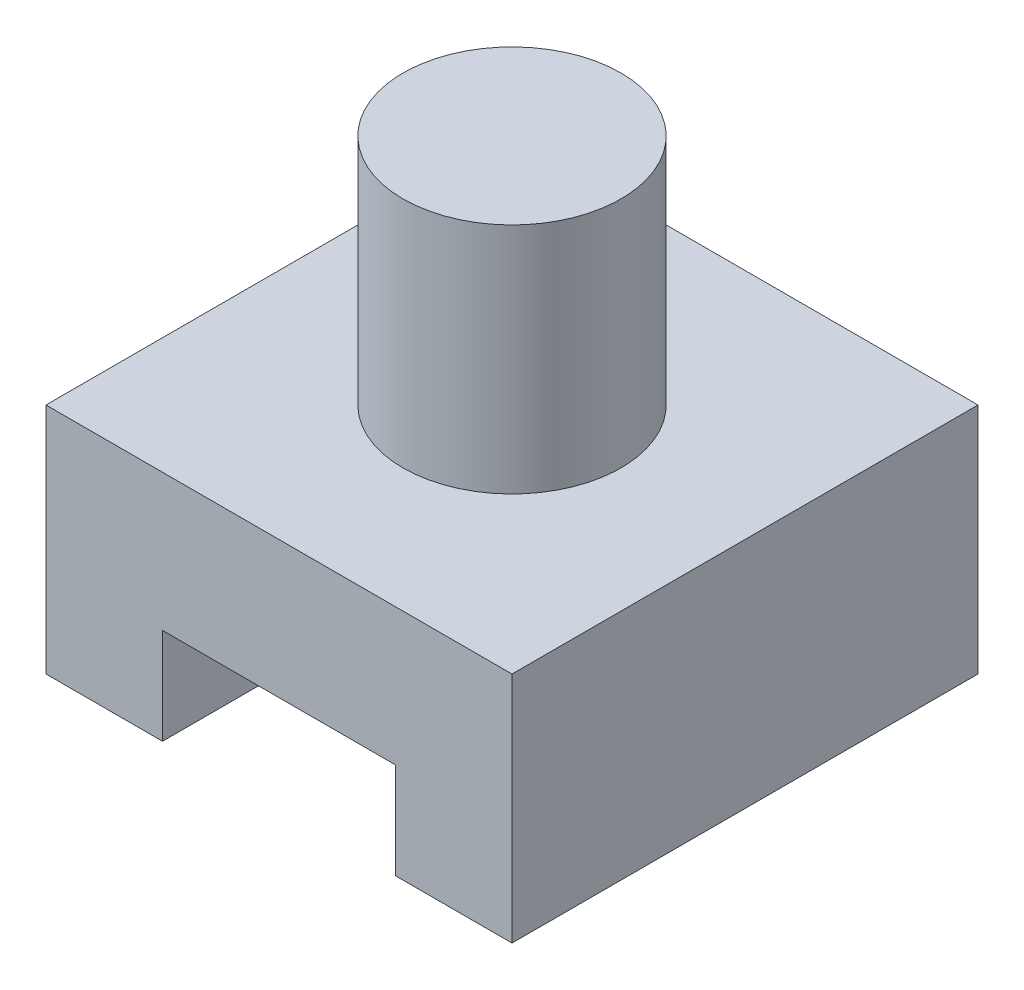
ISO-10303-21;
HEADER;
FILE_DESCRIPTION(('STEP AP214'),'2;1');
FILE_NAME('part.step','',(''),(''),'','','');
FILE_SCHEMA(('AUTOMOTIVE_DESIGN { 1 0 10303 214 1 1 1 1 }'));
ENDSEC;
DATA;
#1=APPLICATION_CONTEXT('core data for automotive mechanical design processes');
#2=APPLICATION_PROTOCOL_DEFINITION('international standard','automotive_design',2000,#1);
#3=PRODUCT_CONTEXT('',#1,'mechanical');
#4=PRODUCT('Part','Part','',(#3));
#5=PRODUCT_RELATED_PRODUCT_CATEGORY('part','',(#4));
#6=PRODUCT_DEFINITION_FORMATION('','',#4);
#7=PRODUCT_DEFINITION_CONTEXT('part definition',#1,'design');
#8=PRODUCT_DEFINITION('design','',#6,#7);
#9=PRODUCT_DEFINITION_SHAPE('','',#8);
#10=(LENGTH_UNIT() NAMED_UNIT(*) SI_UNIT(.MILLI.,.METRE.));
#11=(NAMED_UNIT(*) PLANE_ANGLE_UNIT() SI_UNIT($,.RADIAN.));
#12=(NAMED_UNIT(*) SI_UNIT($,.STERADIAN.) SOLID_ANGLE_UNIT());
#13=UNCERTAINTY_MEASURE_WITH_UNIT(LENGTH_MEASURE(1.E-05),#10,'distance_accuracy_value','');
#14=(GEOMETRIC_REPRESENTATION_CONTEXT(3) GLOBAL_UNCERTAINTY_ASSIGNED_CONTEXT((#13)) GLOBAL_UNIT_ASSIGNED_CONTEXT((#10,
#11,#12)) REPRESENTATION_CONTEXT('',''));
#15=CARTESIAN_POINT('',(0.,0.,0.));
#16=DIRECTION('',(0.,0.,1.));
#17=DIRECTION('',(1.,0.,0.));
#18=AXIS2_PLACEMENT_3D('',#15,#16,#17);
#19=CARTESIAN_POINT('',(0.,0.,0.));
#20=DIRECTION('',(0.,-1.,0.));
#21=DIRECTION('',(0.,0.,-1.));
#22=AXIS2_PLACEMENT_3D('',#19,#20,#21);
#23=PLANE('',#22);
#24=DIRECTION('',(0.,0.,-1.));
#25=VECTOR('',#24,1.);
#26=CARTESIAN_POINT('',(10.,0.,0.));
#27=LINE('',#26,#25);
#28=CARTESIAN_POINT('',(10.,0.,0.));
#29=VERTEX_POINT('',#28);
#30=CARTESIAN_POINT('',(10.,0.,-40.));
#31=VERTEX_POINT('',#30);
#32=EDGE_CURVE('E121',#29,#31,#27,.T.);
#33=ORIENTED_EDGE('',*,*,#32,.F.);
#34=DIRECTION('',(1.,0.,0.));
#35=VECTOR('',#34,1.);
#36=CARTESIAN_POINT('',(0.,0.,0.));
#37=LINE('',#36,#35);
#38=CARTESIAN_POINT('',(0.,0.,0.));
#39=VERTEX_POINT('',#38);
#40=EDGE_CURVE('E136',#39,#29,#37,.T.);
#41=ORIENTED_EDGE('',*,*,#40,.F.);
#42=DIRECTION('',(0.,0.,1.));
#43=VECTOR('',#42,1.);
#44=CARTESIAN_POINT('',(0.,0.,0.));
#45=LINE('',#44,#43);
#46=CARTESIAN_POINT('',(0.,0.,-40.));
#47=VERTEX_POINT('',#46);
#48=EDGE_CURVE('E137',#47,#39,#45,.T.);
#49=ORIENTED_EDGE('',*,*,#48,.F.);
#50=DIRECTION('',(-1.,0.,0.));
#51=VECTOR('',#50,1.);
#52=CARTESIAN_POINT('',(0.,0.,-40.));
#53=LINE('',#52,#51);
#54=EDGE_CURVE('E83',#31,#47,#53,.T.);
#55=ORIENTED_EDGE('',*,*,#54,.F.);
#56=EDGE_LOOP('',(#33,#41,#49,#55));
#57=FACE_BOUND('',#56,.T.);
#58=ADVANCED_FACE('F37',(#57),#23,.T.);
#59=CARTESIAN_POINT('',(0.,20.,0.));
#60=DIRECTION('',(1.,0.,0.));
#61=DIRECTION('',(0.,0.,-1.));
#62=AXIS2_PLACEMENT_3D('',#59,#60,#61);
#63=PLANE('',#62);
#64=ORIENTED_EDGE('',*,*,#48,.T.);
#65=DIRECTION('',(0.,-1.,0.));
#66=VECTOR('',#65,1.);
#67=CARTESIAN_POINT('',(0.,20.,0.));
#68=LINE('',#67,#66);
#69=CARTESIAN_POINT('',(0.,20.,0.));
#70=VERTEX_POINT('',#69);
#71=EDGE_CURVE('E122',#70,#39,#68,.T.);
#72=ORIENTED_EDGE('',*,*,#71,.F.);
#73=DIRECTION('',(0.,0.,1.));
#74=VECTOR('',#73,1.);
#75=CARTESIAN_POINT('',(0.,20.,0.));
#76=LINE('',#75,#74);
#77=CARTESIAN_POINT('',(0.,20.,-40.));
#78=VERTEX_POINT('',#77);
#79=EDGE_CURVE('E147',#78,#70,#76,.T.);
#80=ORIENTED_EDGE('',*,*,#79,.F.);
#81=DIRECTION('',(0.,-1.,0.));
#82=VECTOR('',#81,1.);
#83=CARTESIAN_POINT('',(0.,20.,-40.));
#84=LINE('',#83,#82);
#85=EDGE_CURVE('E148',#78,#47,#84,.T.);
#86=ORIENTED_EDGE('',*,*,#85,.T.);
#87=EDGE_LOOP('',(#64,#72,#80,#86));
#88=FACE_BOUND('',#87,.T.);
#89=ADVANCED_FACE('F39',(#88),#63,.F.);
#90=CARTESIAN_POINT('',(0.,20.,0.));
#91=DIRECTION('',(0.,0.,-1.));
#92=DIRECTION('',(-1.,0.,0.));
#93=AXIS2_PLACEMENT_3D('',#90,#91,#92);
#94=PLANE('',#93);
#95=ORIENTED_EDGE('',*,*,#40,.T.);
#96=DIRECTION('',(0.,-1.,0.));
#97=VECTOR('',#96,1.);
#98=CARTESIAN_POINT('',(10.,0.,0.));
#99=LINE('',#98,#97);
#100=CARTESIAN_POINT('',(10.,8.24257646722698,0.));
#101=VERTEX_POINT('',#100);
#102=EDGE_CURVE('E164',#101,#29,#99,.T.);
#103=ORIENTED_EDGE('',*,*,#102,.F.);
#104=DIRECTION('',(-1.,0.,0.));
#105=VECTOR('',#104,1.);
#106=CARTESIAN_POINT('',(10.,8.24257646722698,0.));
#107=LINE('',#106,#105);
#108=CARTESIAN_POINT('',(30.,8.24257646722698,0.));
#109=VERTEX_POINT('',#108);
#110=EDGE_CURVE('E130',#109,#101,#107,.T.);
#111=ORIENTED_EDGE('',*,*,#110,.F.);
#112=DIRECTION('',(0.,1.,0.));
#113=VECTOR('',#112,1.);
#114=CARTESIAN_POINT('',(30.,8.24257646722698,0.));
#115=LINE('',#114,#113);
#116=CARTESIAN_POINT('',(30.,0.,0.));
#117=VERTEX_POINT('',#116);
#118=EDGE_CURVE('E115',#117,#109,#115,.T.);
#119=ORIENTED_EDGE('',*,*,#118,.F.);
#120=CARTESIAN_POINT('',(40.,0.,0.));
#121=VERTEX_POINT('',#120);
#122=EDGE_CURVE('E126',#117,#121,#37,.T.);
#123=ORIENTED_EDGE('',*,*,#122,.T.);
#124=DIRECTION('',(0.,-1.,0.));
#125=VECTOR('',#124,1.);
#126=CARTESIAN_POINT('',(40.,20.,0.));
#127=LINE('',#126,#125);
#128=CARTESIAN_POINT('',(40.,20.,0.));
#129=VERTEX_POINT('',#128);
#130=EDGE_CURVE('E153',#129,#121,#127,.T.);
#131=ORIENTED_EDGE('',*,*,#130,.F.);
#132=DIRECTION('',(1.,0.,0.));
#133=VECTOR('',#132,1.);
#134=CARTESIAN_POINT('',(0.,20.,0.));
#135=LINE('',#134,#133);
#136=EDGE_CURVE('E91',#70,#129,#135,.T.);
#137=ORIENTED_EDGE('',*,*,#136,.F.);
#138=ORIENTED_EDGE('',*,*,#71,.T.);
#139=EDGE_LOOP('',(#95,#103,#111,#119,#123,#131,#137,#138));
#140=FACE_BOUND('',#139,.T.);
#141=ADVANCED_FACE('F125',(#140),#94,.F.);
#142=CARTESIAN_POINT('',(40.,20.,0.));
#143=DIRECTION('',(-1.,0.,0.));
#144=DIRECTION('',(0.,0.,1.));
#145=AXIS2_PLACEMENT_3D('',#142,#143,#144);
#146=PLANE('',#145);
#147=DIRECTION('',(0.,0.,-1.));
#148=VECTOR('',#147,1.);
#149=CARTESIAN_POINT('',(40.,0.,0.));
#150=LINE('',#149,#148);
#151=CARTESIAN_POINT('',(40.,0.,-40.));
#152=VERTEX_POINT('',#151);
#153=EDGE_CURVE('E135',#121,#152,#150,.T.);
#154=ORIENTED_EDGE('',*,*,#153,.T.);
#155=DIRECTION('',(0.,-1.,0.));
#156=VECTOR('',#155,1.);
#157=CARTESIAN_POINT('',(40.,20.,-40.));
#158=LINE('',#157,#156);
#159=CARTESIAN_POINT('',(40.,20.,-40.));
#160=VERTEX_POINT('',#159);
#161=EDGE_CURVE('E150',#160,#152,#158,.T.);
#162=ORIENTED_EDGE('',*,*,#161,.F.);
#163=DIRECTION('',(0.,0.,-1.));
#164=VECTOR('',#163,1.);
#165=CARTESIAN_POINT('',(40.,20.,0.));
#166=LINE('',#165,#164);
#167=EDGE_CURVE('E173',#129,#160,#166,.T.);
#168=ORIENTED_EDGE('',*,*,#167,.F.);
#169=ORIENTED_EDGE('',*,*,#130,.T.);
#170=EDGE_LOOP('',(#154,#162,#168,#169));
#171=FACE_BOUND('',#170,.T.);
#172=ADVANCED_FACE('F178',(#171),#146,.F.);
#173=CARTESIAN_POINT('',(0.,20.,-40.));
#174=DIRECTION('',(0.,0.,1.));
#175=DIRECTION('',(1.,0.,0.));
#176=AXIS2_PLACEMENT_3D('',#173,#174,#175);
#177=PLANE('',#176);
#178=DIRECTION('',(-1.,0.,0.));
#179=VECTOR('',#178,1.);
#180=CARTESIAN_POINT('',(0.,8.24257646722698,-40.));
#181=LINE('',#180,#179);
#182=CARTESIAN_POINT('',(30.,8.24257646722698,-40.));
#183=VERTEX_POINT('',#182);
#184=CARTESIAN_POINT('',(10.,8.24257646722698,-40.));
#185=VERTEX_POINT('',#184);
#186=EDGE_CURVE('E41',#183,#185,#181,.T.);
#187=ORIENTED_EDGE('',*,*,#186,.T.);
#188=DIRECTION('',(0.,-1.,0.));
#189=VECTOR('',#188,1.);
#190=CARTESIAN_POINT('',(10.,20.,-40.));
#191=LINE('',#190,#189);
#192=EDGE_CURVE('E140',#185,#31,#191,.T.);
#193=ORIENTED_EDGE('',*,*,#192,.T.);
#194=ORIENTED_EDGE('',*,*,#54,.T.);
#195=ORIENTED_EDGE('',*,*,#85,.F.);
#196=DIRECTION('',(-1.,0.,0.));
#197=VECTOR('',#196,1.);
#198=CARTESIAN_POINT('',(0.,20.,-40.));
#199=LINE('',#198,#197);
#200=EDGE_CURVE('E62',#160,#78,#199,.T.);
#201=ORIENTED_EDGE('',*,*,#200,.F.);
#202=ORIENTED_EDGE('',*,*,#161,.T.);
#203=CARTESIAN_POINT('',(30.,0.,-40.));
#204=VERTEX_POINT('',#203);
#205=EDGE_CURVE('E145',#152,#204,#53,.T.);
#206=ORIENTED_EDGE('',*,*,#205,.T.);
#207=DIRECTION('',(0.,1.,0.));
#208=VECTOR('',#207,1.);
#209=CARTESIAN_POINT('',(30.,20.,-40.));
#210=LINE('',#209,#208);
#211=EDGE_CURVE('E53',#204,#183,#210,.T.);
#212=ORIENTED_EDGE('',*,*,#211,.T.);
#213=EDGE_LOOP('',(#187,#193,#194,#195,#201,#202,#206,#212));
#214=FACE_BOUND('',#213,.T.);
#215=ADVANCED_FACE('F158',(#214),#177,.F.);
#216=CARTESIAN_POINT('',(0.,20.,0.));
#217=DIRECTION('',(0.,-1.,0.));
#218=DIRECTION('',(0.,0.,-1.));
#219=AXIS2_PLACEMENT_3D('',#216,#217,#218);
#220=PLANE('',#219);
#221=CARTESIAN_POINT('',(20.,20.,-20.));
#222=DIRECTION('',(0.,1.,0.));
#223=DIRECTION('',(0.,0.,1.));
#224=AXIS2_PLACEMENT_3D('',#221,#222,#223);
#225=CIRCLE('',#224,9.35967193698637);
#226=CARTESIAN_POINT('',(20.,20.,-10.6403280630136));
#227=VERTEX_POINT('',#226);
#228=EDGE_CURVE('E11',#227,#227,#225,.T.);
#229=ORIENTED_EDGE('',*,*,#228,.F.);
#230=EDGE_LOOP('',(#229));
#231=FACE_BOUND('',#230,.T.);
#232=ORIENTED_EDGE('',*,*,#79,.T.);
#233=ORIENTED_EDGE('',*,*,#136,.T.);
#234=ORIENTED_EDGE('',*,*,#167,.T.);
#235=ORIENTED_EDGE('',*,*,#200,.T.);
#236=EDGE_LOOP('',(#232,#233,#234,#235));
#237=FACE_BOUND('',#236,.T.);
#238=ADVANCED_FACE('F176',(#231,#237),#220,.F.);
#239=DIRECTION('',(0.,0.,1.));
#240=VECTOR('',#239,1.);
#241=CARTESIAN_POINT('',(30.,0.,0.));
#242=LINE('',#241,#240);
#243=EDGE_CURVE('E112',#204,#117,#242,.T.);
#244=ORIENTED_EDGE('',*,*,#243,.F.);
#245=ORIENTED_EDGE('',*,*,#205,.F.);
#246=ORIENTED_EDGE('',*,*,#153,.F.);
#247=ORIENTED_EDGE('',*,*,#122,.F.);
#248=EDGE_LOOP('',(#244,#245,#246,#247));
#249=FACE_BOUND('',#248,.T.);
#250=ADVANCED_FACE('F134',(#249),#23,.T.);
#251=CARTESIAN_POINT('',(10.,8.24257646722698,-44.));
#252=DIRECTION('',(0.,1.,0.));
#253=DIRECTION('',(0.,0.,1.));
#254=AXIS2_PLACEMENT_3D('',#251,#252,#253);
#255=PLANE('',#254);
#256=DIRECTION('',(0.,0.,1.));
#257=VECTOR('',#256,1.);
#258=CARTESIAN_POINT('',(30.,8.24257646722698,-44.));
#259=LINE('',#258,#257);
#260=EDGE_CURVE('E162',#183,#109,#259,.T.);
#261=ORIENTED_EDGE('',*,*,#260,.T.);
#262=ORIENTED_EDGE('',*,*,#110,.T.);
#263=DIRECTION('',(0.,0.,1.));
#264=VECTOR('',#263,1.);
#265=CARTESIAN_POINT('',(10.,8.24257646722698,-44.));
#266=LINE('',#265,#264);
#267=EDGE_CURVE('E163',#185,#101,#266,.T.);
#268=ORIENTED_EDGE('',*,*,#267,.F.);
#269=ORIENTED_EDGE('',*,*,#186,.F.);
#270=EDGE_LOOP('',(#261,#262,#268,#269));
#271=FACE_BOUND('',#270,.T.);
#272=ADVANCED_FACE('F161',(#271),#255,.F.);
#273=CARTESIAN_POINT('',(10.,0.,-44.));
#274=DIRECTION('',(-1.,0.,0.));
#275=DIRECTION('',(0.,-1.,0.));
#276=AXIS2_PLACEMENT_3D('',#273,#274,#275);
#277=PLANE('',#276);
#278=ORIENTED_EDGE('',*,*,#267,.T.);
#279=ORIENTED_EDGE('',*,*,#102,.T.);
#280=ORIENTED_EDGE('',*,*,#32,.T.);
#281=ORIENTED_EDGE('',*,*,#192,.F.);
#282=EDGE_LOOP('',(#278,#279,#280,#281));
#283=FACE_BOUND('',#282,.T.);
#284=ADVANCED_FACE('F196',(#283),#277,.F.);
#285=CARTESIAN_POINT('',(30.,8.24257646722698,-44.));
#286=DIRECTION('',(1.,0.,0.));
#287=DIRECTION('',(0.,1.,0.));
#288=AXIS2_PLACEMENT_3D('',#285,#286,#287);
#289=PLANE('',#288);
#290=ORIENTED_EDGE('',*,*,#243,.T.);
#291=ORIENTED_EDGE('',*,*,#118,.T.);
#292=ORIENTED_EDGE('',*,*,#260,.F.);
#293=ORIENTED_EDGE('',*,*,#211,.F.);
#294=EDGE_LOOP('',(#290,#291,#292,#293));
#295=FACE_BOUND('',#294,.T.);
#296=ADVANCED_FACE('F114',(#295),#289,.F.);
#297=CARTESIAN_POINT('',(20.,40.,-20.));
#298=DIRECTION('',(0.,-1.,0.));
#299=DIRECTION('',(0.,0.,-1.));
#300=AXIS2_PLACEMENT_3D('',#297,#298,#299);
#301=CYLINDRICAL_SURFACE('',#300,9.35967193698637);
#302=CARTESIAN_POINT('',(20.,40.,-20.));
#303=DIRECTION('',(0.,1.,0.));
#304=DIRECTION('',(0.,0.,1.));
#305=AXIS2_PLACEMENT_3D('',#302,#303,#304);
#306=CIRCLE('',#305,9.35967193698637);
#307=CARTESIAN_POINT('',(20.,40.,-10.6403280630136));
#308=VERTEX_POINT('',#307);
#309=EDGE_CURVE('E131',#308,#308,#306,.T.);
#310=ORIENTED_EDGE('',*,*,#309,.F.);
#311=EDGE_LOOP('',(#310));
#312=FACE_BOUND('',#311,.T.);
#313=ORIENTED_EDGE('',*,*,#228,.T.);
#314=EDGE_LOOP('',(#313));
#315=FACE_BOUND('',#314,.T.);
#316=ADVANCED_FACE('F205',(#312,#315),#301,.T.);
#317=CARTESIAN_POINT('',(20.,40.,-20.));
#318=DIRECTION('',(0.,1.,0.));
#319=DIRECTION('',(0.,0.,1.));
#320=AXIS2_PLACEMENT_3D('',#317,#318,#319);
#321=PLANE('',#320);
#322=ORIENTED_EDGE('',*,*,#309,.T.);
#323=EDGE_LOOP('',(#322));
#324=FACE_BOUND('',#323,.T.);
#325=ADVANCED_FACE('F211',(#324),#321,.T.);
#326=CLOSED_SHELL('',(#58,#89,#141,#172,#215,#238,#250,#272,#284,#296,#316,#325));
#327=MANIFOLD_SOLID_BREP('B2',#326);
#328=ADVANCED_BREP_SHAPE_REPRESENTATION('',(#18,#327),#14);
#329=SHAPE_DEFINITION_REPRESENTATION(#9,#328);
ENDSEC;
END-ISO-10303-21;
